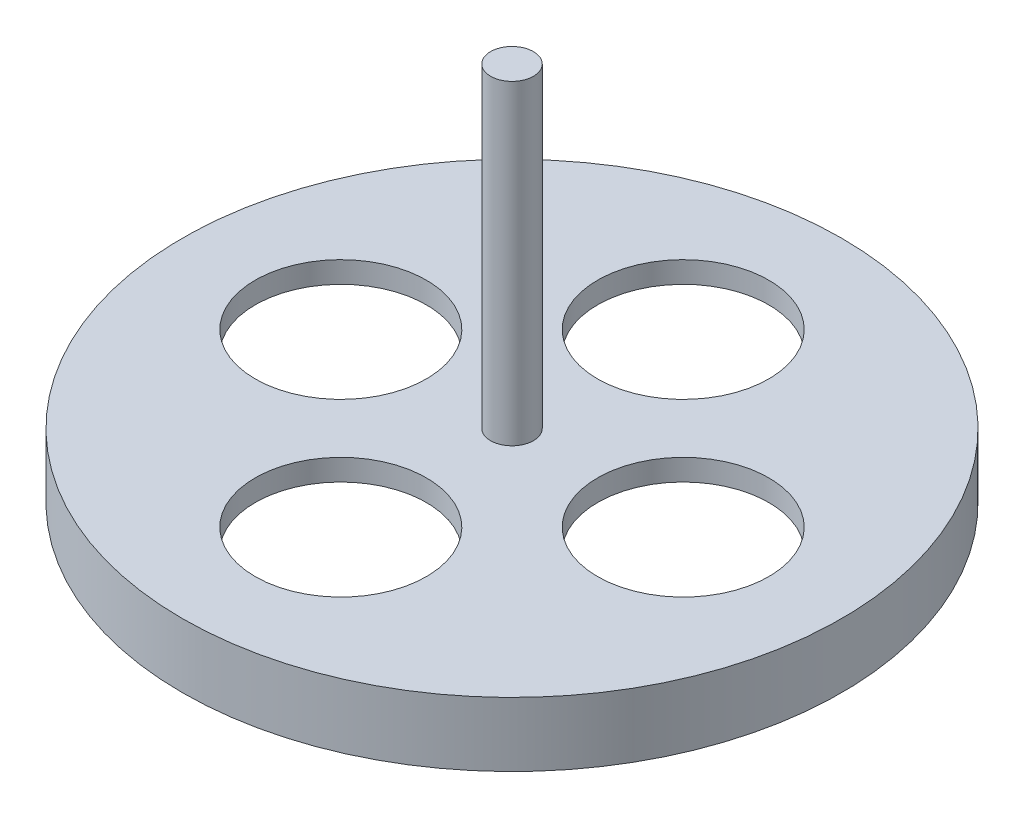
ISO-10303-21;
HEADER;
FILE_DESCRIPTION(('STEP AP214'),'2;1');
FILE_NAME('part.step','',(''),(''),'','','');
FILE_SCHEMA(('AUTOMOTIVE_DESIGN { 1 0 10303 214 1 1 1 1 }'));
ENDSEC;
DATA;
#1=APPLICATION_CONTEXT('core data for automotive mechanical design processes');
#2=APPLICATION_PROTOCOL_DEFINITION('international standard','automotive_design',2000,#1);
#3=PRODUCT_CONTEXT('',#1,'mechanical');
#4=PRODUCT('Part','Part','',(#3));
#5=PRODUCT_RELATED_PRODUCT_CATEGORY('part','',(#4));
#6=PRODUCT_DEFINITION_FORMATION('','',#4);
#7=PRODUCT_DEFINITION_CONTEXT('part definition',#1,'design');
#8=PRODUCT_DEFINITION('design','',#6,#7);
#9=PRODUCT_DEFINITION_SHAPE('','',#8);
#10=(LENGTH_UNIT() NAMED_UNIT(*) SI_UNIT(.MILLI.,.METRE.));
#11=(NAMED_UNIT(*) PLANE_ANGLE_UNIT() SI_UNIT($,.RADIAN.));
#12=(NAMED_UNIT(*) SI_UNIT($,.STERADIAN.) SOLID_ANGLE_UNIT());
#13=UNCERTAINTY_MEASURE_WITH_UNIT(LENGTH_MEASURE(1.E-05),#10,'distance_accuracy_value','');
#14=(GEOMETRIC_REPRESENTATION_CONTEXT(3) GLOBAL_UNCERTAINTY_ASSIGNED_CONTEXT((#13)) GLOBAL_UNIT_ASSIGNED_CONTEXT((#10,
#11,#12)) REPRESENTATION_CONTEXT('',''));
#15=CARTESIAN_POINT('',(0.,0.,0.));
#16=DIRECTION('',(0.,0.,1.));
#17=DIRECTION('',(1.,0.,0.));
#18=AXIS2_PLACEMENT_3D('',#15,#16,#17);
#19=CARTESIAN_POINT('',(0.,0.,0.));
#20=DIRECTION('',(0.,1.,0.));
#21=DIRECTION('',(0.,0.,1.));
#22=AXIS2_PLACEMENT_3D('',#19,#20,#21);
#23=PLANE('',#22);
#24=CARTESIAN_POINT('',(0.,0.,0.));
#25=DIRECTION('',(0.,1.,0.));
#26=DIRECTION('',(0.,0.,1.));
#27=AXIS2_PLACEMENT_3D('',#24,#25,#26);
#28=CIRCLE('',#27,48.895);
#29=CARTESIAN_POINT('',(0.,0.,48.895));
#30=VERTEX_POINT('',#29);
#31=EDGE_CURVE('E10',#30,#30,#28,.T.);
#32=ORIENTED_EDGE('',*,*,#31,.F.);
#33=EDGE_LOOP('',(#32));
#34=FACE_BOUND('',#33,.T.);
#35=CARTESIAN_POINT('',(0.,0.,0.));
#36=DIRECTION('',(0.,1.,0.));
#37=DIRECTION('',(0.,0.,1.));
#38=AXIS2_PLACEMENT_3D('',#35,#36,#37);
#39=CIRCLE('',#38,45.72);
#40=CARTESIAN_POINT('',(0.,0.,45.72));
#41=VERTEX_POINT('',#40);
#42=EDGE_CURVE('E38',#41,#41,#39,.T.);
#43=ORIENTED_EDGE('',*,*,#42,.T.);
#44=EDGE_LOOP('',(#43));
#45=FACE_BOUND('',#44,.T.);
#46=ADVANCED_FACE('F31',(#34,#45),#23,.F.);
#47=CARTESIAN_POINT('',(0.,6.35,0.));
#48=DIRECTION('',(0.,-1.,0.));
#49=DIRECTION('',(0.,0.,-1.));
#50=AXIS2_PLACEMENT_3D('',#47,#48,#49);
#51=CYLINDRICAL_SURFACE('',#50,48.895);
#52=ORIENTED_EDGE('',*,*,#31,.T.);
#53=EDGE_LOOP('',(#52));
#54=FACE_BOUND('',#53,.T.);
#55=CARTESIAN_POINT('',(0.,9.525,0.));
#56=DIRECTION('',(0.,1.,0.));
#57=DIRECTION('',(0.,0.,1.));
#58=AXIS2_PLACEMENT_3D('',#55,#56,#57);
#59=CIRCLE('',#58,48.895);
#60=CARTESIAN_POINT('',(0.,9.525,48.895));
#61=VERTEX_POINT('',#60);
#62=EDGE_CURVE('E46',#61,#61,#59,.T.);
#63=ORIENTED_EDGE('',*,*,#62,.F.);
#64=EDGE_LOOP('',(#63));
#65=FACE_BOUND('',#64,.T.);
#66=ADVANCED_FACE('F33',(#54,#65),#51,.T.);
#67=CARTESIAN_POINT('',(0.,6.35,0.));
#68=DIRECTION('',(0.,-1.,0.));
#69=DIRECTION('',(0.,0.,-1.));
#70=AXIS2_PLACEMENT_3D('',#67,#68,#69);
#71=CYLINDRICAL_SURFACE('',#70,45.72);
#72=CARTESIAN_POINT('',(0.,6.35,0.));
#73=DIRECTION('',(0.,1.,0.));
#74=DIRECTION('',(0.,0.,1.));
#75=AXIS2_PLACEMENT_3D('',#72,#73,#74);
#76=CIRCLE('',#75,45.72);
#77=CARTESIAN_POINT('',(0.,6.35,45.72));
#78=VERTEX_POINT('',#77);
#79=EDGE_CURVE('E42',#78,#78,#76,.T.);
#80=ORIENTED_EDGE('',*,*,#79,.T.);
#81=EDGE_LOOP('',(#80));
#82=FACE_BOUND('',#81,.T.);
#83=ORIENTED_EDGE('',*,*,#42,.F.);
#84=EDGE_LOOP('',(#83));
#85=FACE_BOUND('',#84,.T.);
#86=ADVANCED_FACE('F115',(#82,#85),#71,.F.);
#87=CARTESIAN_POINT('',(0.,6.35,0.));
#88=DIRECTION('',(0.,1.,0.));
#89=DIRECTION('',(0.,0.,1.));
#90=AXIS2_PLACEMENT_3D('',#87,#88,#89);
#91=PLANE('',#90);
#92=CARTESIAN_POINT('',(-25.3999999999993,6.35,7.21911419532262E-13));
#93=DIRECTION('',(0.,1.,0.));
#94=DIRECTION('',(0.,0.,1.));
#95=AXIS2_PLACEMENT_3D('',#92,#93,#94);
#96=CIRCLE('',#95,12.7000000000012);
#97=CARTESIAN_POINT('',(-25.3999999999993,6.35,12.7000000000019));
#98=VERTEX_POINT('',#97);
#99=EDGE_CURVE('E70',#98,#98,#96,.T.);
#100=ORIENTED_EDGE('',*,*,#99,.T.);
#101=EDGE_LOOP('',(#100));
#102=FACE_BOUND('',#101,.T.);
#103=CARTESIAN_POINT('',(1.43760163332486E-12,6.35,25.4));
#104=DIRECTION('',(0.,1.,0.));
#105=DIRECTION('',(0.,0.,1.));
#106=AXIS2_PLACEMENT_3D('',#103,#104,#105);
#107=CIRCLE('',#106,12.7000000000015);
#108=CARTESIAN_POINT('',(1.43760163332486E-12,6.35,38.1000000000016));
#109=VERTEX_POINT('',#108);
#110=EDGE_CURVE('E64',#109,#109,#107,.T.);
#111=ORIENTED_EDGE('',*,*,#110,.T.);
#112=EDGE_LOOP('',(#111));
#113=FACE_BOUND('',#112,.T.);
#114=CARTESIAN_POINT('',(25.4,6.35,0.));
#115=DIRECTION('',(0.,1.,0.));
#116=DIRECTION('',(0.,0.,1.));
#117=AXIS2_PLACEMENT_3D('',#114,#115,#116);
#118=CIRCLE('',#117,12.7);
#119=CARTESIAN_POINT('',(25.4,6.35,12.7000000000001));
#120=VERTEX_POINT('',#119);
#121=EDGE_CURVE('E58',#120,#120,#118,.T.);
#122=ORIENTED_EDGE('',*,*,#121,.T.);
#123=EDGE_LOOP('',(#122));
#124=FACE_BOUND('',#123,.T.);
#125=CARTESIAN_POINT('',(0.,6.35,-25.4));
#126=DIRECTION('',(0.,1.,0.));
#127=DIRECTION('',(0.,0.,1.));
#128=AXIS2_PLACEMENT_3D('',#125,#126,#127);
#129=CIRCLE('',#128,12.7);
#130=CARTESIAN_POINT('',(0.,6.35,-12.7));
#131=VERTEX_POINT('',#130);
#132=EDGE_CURVE('E52',#131,#131,#129,.T.);
#133=ORIENTED_EDGE('',*,*,#132,.T.);
#134=EDGE_LOOP('',(#133));
#135=FACE_BOUND('',#134,.T.);
#136=ORIENTED_EDGE('',*,*,#79,.F.);
#137=EDGE_LOOP('',(#136));
#138=FACE_BOUND('',#137,.T.);
#139=ADVANCED_FACE('F95',(#102,#113,#124,#135,#138),#91,.F.);
#140=CARTESIAN_POINT('',(0.,9.525,0.));
#141=DIRECTION('',(0.,1.,0.));
#142=DIRECTION('',(0.,0.,1.));
#143=AXIS2_PLACEMENT_3D('',#140,#141,#142);
#144=PLANE('',#143);
#145=CARTESIAN_POINT('',(0.,9.525,0.));
#146=DIRECTION('',(0.,1.,0.));
#147=DIRECTION('',(0.,0.,1.));
#148=AXIS2_PLACEMENT_3D('',#145,#146,#147);
#149=CIRCLE('',#148,3.175);
#150=CARTESIAN_POINT('',(0.,9.525,3.175));
#151=VERTEX_POINT('',#150);
#152=EDGE_CURVE('E76',#151,#151,#149,.T.);
#153=ORIENTED_EDGE('',*,*,#152,.F.);
#154=EDGE_LOOP('',(#153));
#155=FACE_BOUND('',#154,.T.);
#156=CARTESIAN_POINT('',(1.43760163332486E-12,9.525,25.4));
#157=DIRECTION('',(0.,1.,0.));
#158=DIRECTION('',(0.,0.,1.));
#159=AXIS2_PLACEMENT_3D('',#156,#157,#158);
#160=CIRCLE('',#159,12.7000000000015);
#161=CARTESIAN_POINT('',(1.43760163332486E-12,9.525,38.1000000000016));
#162=VERTEX_POINT('',#161);
#163=EDGE_CURVE('E61',#162,#162,#160,.T.);
#164=ORIENTED_EDGE('',*,*,#163,.F.);
#165=EDGE_LOOP('',(#164));
#166=FACE_BOUND('',#165,.T.);
#167=CARTESIAN_POINT('',(0.,9.525,-25.4));
#168=DIRECTION('',(0.,1.,0.));
#169=DIRECTION('',(0.,0.,1.));
#170=AXIS2_PLACEMENT_3D('',#167,#168,#169);
#171=CIRCLE('',#170,12.7);
#172=CARTESIAN_POINT('',(0.,9.525,-12.7));
#173=VERTEX_POINT('',#172);
#174=EDGE_CURVE('E51',#173,#173,#171,.T.);
#175=ORIENTED_EDGE('',*,*,#174,.F.);
#176=EDGE_LOOP('',(#175));
#177=FACE_BOUND('',#176,.T.);
#178=ORIENTED_EDGE('',*,*,#62,.T.);
#179=EDGE_LOOP('',(#178));
#180=FACE_BOUND('',#179,.T.);
#181=CARTESIAN_POINT('',(25.4,9.525,0.));
#182=DIRECTION('',(0.,1.,0.));
#183=DIRECTION('',(0.,0.,1.));
#184=AXIS2_PLACEMENT_3D('',#181,#182,#183);
#185=CIRCLE('',#184,12.7);
#186=CARTESIAN_POINT('',(25.4,9.525,12.7000000000001));
#187=VERTEX_POINT('',#186);
#188=EDGE_CURVE('E55',#187,#187,#185,.T.);
#189=ORIENTED_EDGE('',*,*,#188,.F.);
#190=EDGE_LOOP('',(#189));
#191=FACE_BOUND('',#190,.T.);
#192=CARTESIAN_POINT('',(-25.3999999999993,9.525,7.21911419532262E-13));
#193=DIRECTION('',(0.,1.,0.));
#194=DIRECTION('',(0.,0.,1.));
#195=AXIS2_PLACEMENT_3D('',#192,#193,#194);
#196=CIRCLE('',#195,12.7000000000012);
#197=CARTESIAN_POINT('',(-25.3999999999993,9.525,12.7000000000019));
#198=VERTEX_POINT('',#197);
#199=EDGE_CURVE('E67',#198,#198,#196,.T.);
#200=ORIENTED_EDGE('',*,*,#199,.F.);
#201=EDGE_LOOP('',(#200));
#202=FACE_BOUND('',#201,.T.);
#203=ADVANCED_FACE('F91',(#155,#166,#177,#180,#191,#202),#144,.T.);
#204=CARTESIAN_POINT('',(0.,9.525,-25.4));
#205=DIRECTION('',(0.,-1.,0.));
#206=DIRECTION('',(0.,0.,-1.));
#207=AXIS2_PLACEMENT_3D('',#204,#205,#206);
#208=CYLINDRICAL_SURFACE('',#207,12.7);
#209=ORIENTED_EDGE('',*,*,#174,.T.);
#210=EDGE_LOOP('',(#209));
#211=FACE_BOUND('',#210,.T.);
#212=ORIENTED_EDGE('',*,*,#132,.F.);
#213=EDGE_LOOP('',(#212));
#214=FACE_BOUND('',#213,.T.);
#215=ADVANCED_FACE('F94',(#211,#214),#208,.F.);
#216=CARTESIAN_POINT('',(25.4,9.525,0.));
#217=DIRECTION('',(0.,-1.,0.));
#218=DIRECTION('',(0.,0.,-1.));
#219=AXIS2_PLACEMENT_3D('',#216,#217,#218);
#220=CYLINDRICAL_SURFACE('',#219,12.7);
#221=ORIENTED_EDGE('',*,*,#188,.T.);
#222=EDGE_LOOP('',(#221));
#223=FACE_BOUND('',#222,.T.);
#224=ORIENTED_EDGE('',*,*,#121,.F.);
#225=EDGE_LOOP('',(#224));
#226=FACE_BOUND('',#225,.T.);
#227=ADVANCED_FACE('F158',(#223,#226),#220,.F.);
#228=CARTESIAN_POINT('',(1.43760163332486E-12,9.525,25.4));
#229=DIRECTION('',(0.,-1.,0.));
#230=DIRECTION('',(0.,0.,-1.));
#231=AXIS2_PLACEMENT_3D('',#228,#229,#230);
#232=CYLINDRICAL_SURFACE('',#231,12.7000000000015);
#233=ORIENTED_EDGE('',*,*,#163,.T.);
#234=EDGE_LOOP('',(#233));
#235=FACE_BOUND('',#234,.T.);
#236=ORIENTED_EDGE('',*,*,#110,.F.);
#237=EDGE_LOOP('',(#236));
#238=FACE_BOUND('',#237,.T.);
#239=ADVANCED_FACE('F109',(#235,#238),#232,.F.);
#240=CARTESIAN_POINT('',(-25.3999999999993,9.525,7.21911419532262E-13));
#241=DIRECTION('',(0.,-1.,0.));
#242=DIRECTION('',(0.,0.,-1.));
#243=AXIS2_PLACEMENT_3D('',#240,#241,#242);
#244=CYLINDRICAL_SURFACE('',#243,12.7000000000012);
#245=ORIENTED_EDGE('',*,*,#199,.T.);
#246=EDGE_LOOP('',(#245));
#247=FACE_BOUND('',#246,.T.);
#248=ORIENTED_EDGE('',*,*,#99,.F.);
#249=EDGE_LOOP('',(#248));
#250=FACE_BOUND('',#249,.T.);
#251=ADVANCED_FACE('F87',(#247,#250),#244,.F.);
#252=CARTESIAN_POINT('',(0.,56.35,0.));
#253=DIRECTION('',(0.,-1.,0.));
#254=DIRECTION('',(0.,0.,-1.));
#255=AXIS2_PLACEMENT_3D('',#252,#253,#254);
#256=CYLINDRICAL_SURFACE('',#255,3.175);
#257=CARTESIAN_POINT('',(0.,56.35,0.));
#258=DIRECTION('',(0.,1.,0.));
#259=DIRECTION('',(0.,0.,1.));
#260=AXIS2_PLACEMENT_3D('',#257,#258,#259);
#261=CIRCLE('',#260,3.175);
#262=CARTESIAN_POINT('',(0.,56.35,3.175));
#263=VERTEX_POINT('',#262);
#264=EDGE_CURVE('E73',#263,#263,#261,.T.);
#265=ORIENTED_EDGE('',*,*,#264,.F.);
#266=EDGE_LOOP('',(#265));
#267=FACE_BOUND('',#266,.T.);
#268=ORIENTED_EDGE('',*,*,#152,.T.);
#269=EDGE_LOOP('',(#268));
#270=FACE_BOUND('',#269,.T.);
#271=ADVANCED_FACE('F84',(#267,#270),#256,.T.);
#272=CARTESIAN_POINT('',(0.,56.35,0.));
#273=DIRECTION('',(0.,1.,0.));
#274=DIRECTION('',(0.,0.,1.));
#275=AXIS2_PLACEMENT_3D('',#272,#273,#274);
#276=PLANE('',#275);
#277=ORIENTED_EDGE('',*,*,#264,.T.);
#278=EDGE_LOOP('',(#277));
#279=FACE_BOUND('',#278,.T.);
#280=ADVANCED_FACE('F82',(#279),#276,.T.);
#281=CLOSED_SHELL('',(#46,#66,#86,#139,#203,#215,#227,#239,#251,#271,#280));
#282=MANIFOLD_SOLID_BREP('B2',#281);
#283=ADVANCED_BREP_SHAPE_REPRESENTATION('',(#18,#282),#14);
#284=SHAPE_DEFINITION_REPRESENTATION(#9,#283);
ENDSEC;
END-ISO-10303-21;
